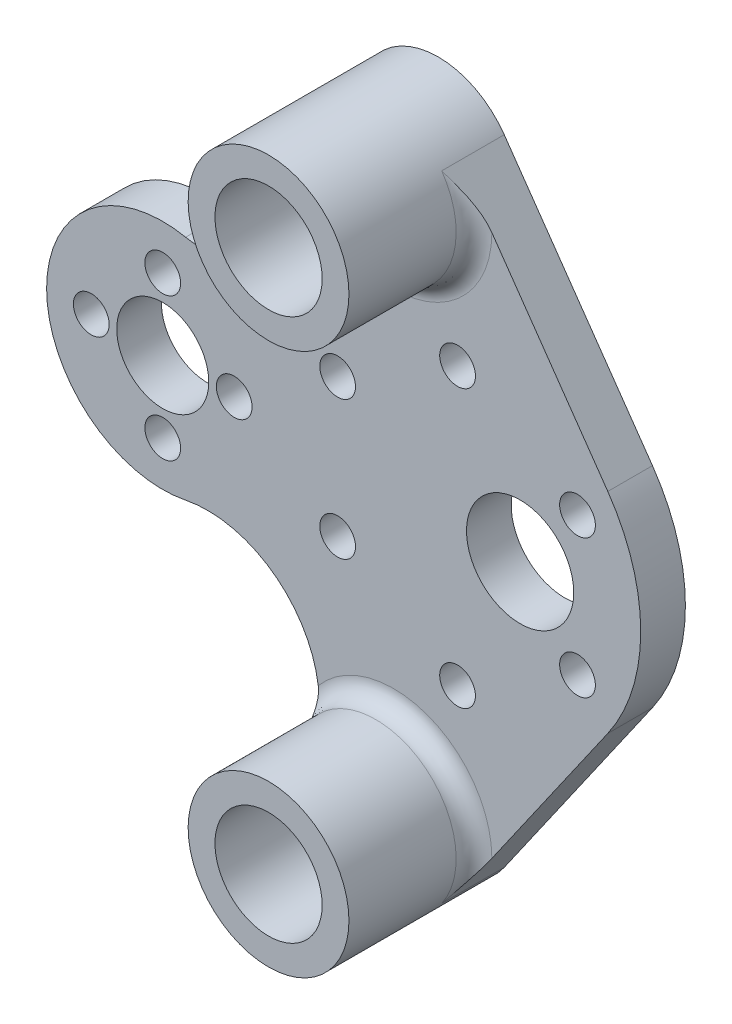
ISO-10303-21;
HEADER;
FILE_DESCRIPTION(('STEP AP214'),'2;1');
FILE_NAME('part.step','',(''),(''),'','','');
FILE_SCHEMA(('AUTOMOTIVE_DESIGN { 1 0 10303 214 1 1 1 1 }'));
ENDSEC;
DATA;
#1=APPLICATION_CONTEXT('core data for automotive mechanical design processes');
#2=APPLICATION_PROTOCOL_DEFINITION('international standard','automotive_design',2000,#1);
#3=PRODUCT_CONTEXT('',#1,'mechanical');
#4=PRODUCT('Part','Part','',(#3));
#5=PRODUCT_RELATED_PRODUCT_CATEGORY('part','',(#4));
#6=PRODUCT_DEFINITION_FORMATION('','',#4);
#7=PRODUCT_DEFINITION_CONTEXT('part definition',#1,'design');
#8=PRODUCT_DEFINITION('design','',#6,#7);
#9=PRODUCT_DEFINITION_SHAPE('','',#8);
#10=(LENGTH_UNIT() NAMED_UNIT(*) SI_UNIT(.MILLI.,.METRE.));
#11=(NAMED_UNIT(*) PLANE_ANGLE_UNIT() SI_UNIT($,.RADIAN.));
#12=(NAMED_UNIT(*) SI_UNIT($,.STERADIAN.) SOLID_ANGLE_UNIT());
#13=UNCERTAINTY_MEASURE_WITH_UNIT(LENGTH_MEASURE(1.E-05),#10,'distance_accuracy_value','');
#14=(GEOMETRIC_REPRESENTATION_CONTEXT(3) GLOBAL_UNCERTAINTY_ASSIGNED_CONTEXT((#13)) GLOBAL_UNIT_ASSIGNED_CONTEXT((#10,
#11,#12)) REPRESENTATION_CONTEXT('',''));
#15=CARTESIAN_POINT('',(0.,0.,0.));
#16=DIRECTION('',(0.,0.,1.));
#17=DIRECTION('',(1.,0.,0.));
#18=AXIS2_PLACEMENT_3D('',#15,#16,#17);
#19=CARTESIAN_POINT('',(-34.9787159958028,25.000734128205,5.));
#20=DIRECTION('',(0.,0.,-1.));
#21=DIRECTION('',(-1.,0.,0.));
#22=AXIS2_PLACEMENT_3D('',#19,#20,#21);
#23=CYLINDRICAL_SURFACE('',#22,12.5);
#24=CARTESIAN_POINT('',(-34.9787159958028,25.000734128205,0.));
#25=DIRECTION('',(0.,0.,1.));
#26=DIRECTION('',(1.,0.,0.));
#27=AXIS2_PLACEMENT_3D('',#24,#25,#26);
#28=CIRCLE('',#27,12.5);
#29=CARTESIAN_POINT('',(-37.4401297233505,12.7454723006535,0.));
#30=VERTEX_POINT('',#29);
#31=CARTESIAN_POINT('',(-22.8734809798206,28.1173485104857,0.));
#32=VERTEX_POINT('',#31);
#33=EDGE_CURVE('E132',#30,#32,#28,.T.);
#34=ORIENTED_EDGE('',*,*,#33,.F.);
#35=DIRECTION('',(0.,0.,-1.));
#36=VECTOR('',#35,1.);
#37=CARTESIAN_POINT('',(-37.4401297233505,12.7454723006535,5.));
#38=LINE('',#37,#36);
#39=CARTESIAN_POINT('',(-37.4401297233505,12.7454723006535,5.));
#40=VERTEX_POINT('',#39);
#41=EDGE_CURVE('E126',#40,#30,#38,.T.);
#42=ORIENTED_EDGE('',*,*,#41,.F.);
#43=CARTESIAN_POINT('',(-34.9787159958028,25.000734128205,5.));
#44=DIRECTION('',(0.,0.,1.));
#45=DIRECTION('',(1.,0.,0.));
#46=AXIS2_PLACEMENT_3D('',#43,#44,#45);
#47=CIRCLE('',#46,12.5);
#48=CARTESIAN_POINT('',(-22.5945455110129,23.3029940410132,5.));
#49=VERTEX_POINT('',#48);
#50=EDGE_CURVE('E130',#40,#49,#47,.T.);
#51=ORIENTED_EDGE('',*,*,#50,.T.);
#52=CARTESIAN_POINT('',(-22.5945455110129,23.3029940410132,5.));
#53=CARTESIAN_POINT('',(-22.5784386509426,23.4203873491574,5.00002194984655));
#54=CARTESIAN_POINT('',(-22.5640454098851,23.5378776584073,5.00576122954195));
#55=CARTESIAN_POINT('',(-22.5386946692942,23.7720686453386,5.02720305167435));
#56=CARTESIAN_POINT('',(-22.5277295054616,23.8887705054181,5.04288312772296));
#57=CARTESIAN_POINT('',(-22.5092806636017,24.1195652206952,5.08251290412739));
#58=CARTESIAN_POINT('',(-22.5017573983285,24.2336726111073,5.10636275248234));
#59=CARTESIAN_POINT('',(-22.4898841596137,24.4603905722542,5.16118223006757));
#60=CARTESIAN_POINT('',(-22.4855364212632,24.5730000340461,5.19215685393875));
#61=CARTESIAN_POINT('',(-22.4776205870708,24.8860256295329,5.28739886174794));
#62=CARTESIAN_POINT('',(-22.47747085748,25.0844724260291,5.35845119894978));
#63=CARTESIAN_POINT('',(-22.4861968563972,25.4753391982504,5.5150180032576));
#64=CARTESIAN_POINT('',(-22.4950786517616,25.6677550331645,5.60054215950437));
#65=CARTESIAN_POINT('',(-22.5212121377226,26.0482035544097,5.78268239757344));
#66=CARTESIAN_POINT('',(-22.5385194306428,26.2361983012766,5.87936886296627));
#67=CARTESIAN_POINT('',(-22.5809658989403,26.6071717159508,6.08011346235826));
#68=CARTESIAN_POINT('',(-22.6061026926867,26.7901518907344,6.18416934725042));
#69=CARTESIAN_POINT('',(-22.6658031537744,27.1641570378331,6.40412549696805));
#70=CARTESIAN_POINT('',(-22.7008835848277,27.354905018663,6.52035290831706));
#71=CARTESIAN_POINT('',(-22.7793742854088,27.7326174268201,6.7551836635535));
#72=CARTESIAN_POINT('',(-22.8227668453753,27.9195889802816,6.87378148440071));
#73=CARTESIAN_POINT('',(-22.8714375341858,28.1094034504309,6.99492817466204));
#74=CARTESIAN_POINT('',(-22.8724582831702,28.1133762361005,6.997464090689));
#75=CARTESIAN_POINT('',(-22.8734809798206,28.1173485104857,7.));
#76=B_SPLINE_CURVE_WITH_KNOTS('',3,(#52,#53,#54,#55,#56,#57,#58,#59,#60,#61,#62,#63,#64,#65,#66,
#67,#68,#69,#70,#71,#72,#73,#74,#75),.UNSPECIFIED.,.F.,.F.,(4,2,2,2,2,2,2,2,2,2,2,4),(0.,
0.355133282033193,0.709466803420707,1.05961561549306,1.4100106425511,2.04126925347174,
2.67295218774211,3.30886148192544,3.9445775294873,4.62267721642209,5.2993479190519,
5.31381520498501),.UNSPECIFIED.);
#77=CARTESIAN_POINT('',(-22.8734809798206,28.1173485104857,7.));
#78=VERTEX_POINT('',#77);
#79=EDGE_CURVE('E283',#49,#78,#76,.T.);
#80=ORIENTED_EDGE('',*,*,#79,.T.);
#81=DIRECTION('',(0.,0.,-1.));
#82=VECTOR('',#81,1.);
#83=CARTESIAN_POINT('',(-22.8734809798206,28.1173485104857,5.));
#84=LINE('',#83,#82);
#85=EDGE_CURVE('E206',#78,#32,#84,.T.);
#86=ORIENTED_EDGE('',*,*,#85,.T.);
#87=EDGE_LOOP('',(#34,#42,#51,#80,#86));
#88=FACE_BOUND('',#87,.T.);
#89=ADVANCED_FACE('F43',(#88),#23,.F.);
#90=CARTESIAN_POINT('',(-40.,0.,5.));
#91=DIRECTION('',(0.,0.,-1.));
#92=DIRECTION('',(-1.,0.,0.));
#93=AXIS2_PLACEMENT_3D('',#90,#91,#92);
#94=CYLINDRICAL_SURFACE('',#93,13.);
#95=CARTESIAN_POINT('',(-40.,0.,0.));
#96=DIRECTION('',(0.,0.,1.));
#97=DIRECTION('',(1.,0.,0.));
#98=AXIS2_PLACEMENT_3D('',#95,#96,#97);
#99=CIRCLE('',#98,13.);
#100=CARTESIAN_POINT('',(-37.4401297233505,-12.7454723006535,0.));
#101=VERTEX_POINT('',#100);
#102=EDGE_CURVE('E208',#30,#101,#99,.T.);
#103=ORIENTED_EDGE('',*,*,#102,.T.);
#104=DIRECTION('',(0.,0.,-1.));
#105=VECTOR('',#104,1.);
#106=CARTESIAN_POINT('',(-37.4401297233505,-12.7454723006535,5.));
#107=LINE('',#106,#105);
#108=CARTESIAN_POINT('',(-37.4401297233505,-12.7454723006535,5.));
#109=VERTEX_POINT('',#108);
#110=EDGE_CURVE('E137',#109,#101,#107,.T.);
#111=ORIENTED_EDGE('',*,*,#110,.F.);
#112=CARTESIAN_POINT('',(-40.,0.,5.));
#113=DIRECTION('',(0.,0.,1.));
#114=DIRECTION('',(1.,0.,0.));
#115=AXIS2_PLACEMENT_3D('',#112,#113,#114);
#116=CIRCLE('',#115,13.);
#117=EDGE_CURVE('E141',#40,#109,#116,.T.);
#118=ORIENTED_EDGE('',*,*,#117,.F.);
#119=ORIENTED_EDGE('',*,*,#41,.T.);
#120=EDGE_LOOP('',(#103,#111,#118,#119));
#121=FACE_BOUND('',#120,.T.);
#122=ADVANCED_FACE('F142',(#121),#94,.T.);
#123=CARTESIAN_POINT('',(-34.9787159958028,-25.000734128205,5.));
#124=DIRECTION('',(0.,0.,-1.));
#125=DIRECTION('',(-1.,0.,0.));
#126=AXIS2_PLACEMENT_3D('',#123,#124,#125);
#127=CYLINDRICAL_SURFACE('',#126,12.5);
#128=CARTESIAN_POINT('',(-34.9787159958028,-25.000734128205,0.));
#129=DIRECTION('',(0.,0.,1.));
#130=DIRECTION('',(1.,0.,0.));
#131=AXIS2_PLACEMENT_3D('',#128,#129,#130);
#132=CIRCLE('',#131,12.5);
#133=CARTESIAN_POINT('',(-22.8734809798206,-28.1173485104857,0.));
#134=VERTEX_POINT('',#133);
#135=EDGE_CURVE('E210',#134,#101,#132,.T.);
#136=ORIENTED_EDGE('',*,*,#135,.F.);
#137=DIRECTION('',(0.,0.,-1.));
#138=VECTOR('',#137,1.);
#139=CARTESIAN_POINT('',(-22.8734809798206,-28.1173485104857,5.));
#140=LINE('',#139,#138);
#141=CARTESIAN_POINT('',(-22.8734809798206,-28.1173485104857,7.));
#142=VERTEX_POINT('',#141);
#143=EDGE_CURVE('E64',#142,#134,#140,.T.);
#144=ORIENTED_EDGE('',*,*,#143,.F.);
#145=CARTESIAN_POINT('',(-22.5945455110129,-23.3029940410132,5.));
#146=CARTESIAN_POINT('',(-22.5784386509426,-23.4203873491574,5.00002194984655));
#147=CARTESIAN_POINT('',(-22.5640454098851,-23.5378776584073,5.00576122954195));
#148=CARTESIAN_POINT('',(-22.5386946692942,-23.7720686453386,5.02720305167435));
#149=CARTESIAN_POINT('',(-22.5277295054616,-23.8887705054181,5.04288312772296));
#150=CARTESIAN_POINT('',(-22.5092806636017,-24.1195652206952,5.08251290412739));
#151=CARTESIAN_POINT('',(-22.5017573983285,-24.2336726111073,5.10636275248234));
#152=CARTESIAN_POINT('',(-22.4898841596137,-24.4603905722542,5.16118223006757));
#153=CARTESIAN_POINT('',(-22.4855364212632,-24.5730000340461,5.19215685393875));
#154=CARTESIAN_POINT('',(-22.4776205870708,-24.8860256295329,5.28739886174794));
#155=CARTESIAN_POINT('',(-22.47747085748,-25.0844724260291,5.35845119894978));
#156=CARTESIAN_POINT('',(-22.4861968563972,-25.4753391982504,5.5150180032576));
#157=CARTESIAN_POINT('',(-22.4950786517616,-25.6677550331645,5.60054215950437));
#158=CARTESIAN_POINT('',(-22.5212121377226,-26.0482035544097,5.78268239757344));
#159=CARTESIAN_POINT('',(-22.5385194306428,-26.2361983012766,5.87936886296627));
#160=CARTESIAN_POINT('',(-22.5809658989403,-26.6071717159508,6.08011346235826));
#161=CARTESIAN_POINT('',(-22.6061026926867,-26.7901518907344,6.18416934725042));
#162=CARTESIAN_POINT('',(-22.6658031537744,-27.1641570378331,6.40412549696805));
#163=CARTESIAN_POINT('',(-22.7008835848277,-27.354905018663,6.52035290831706));
#164=CARTESIAN_POINT('',(-22.7793742854088,-27.7326174268201,6.7551836635535));
#165=CARTESIAN_POINT('',(-22.8227668453753,-27.9195889802816,6.87378148440071));
#166=CARTESIAN_POINT('',(-22.8714375341858,-28.1094034504309,6.99492817466204));
#167=CARTESIAN_POINT('',(-22.8724582831702,-28.1133762361005,6.997464090689));
#168=CARTESIAN_POINT('',(-22.8734809798206,-28.1173485104857,7.));
#169=B_SPLINE_CURVE_WITH_KNOTS('',3,(#145,#146,#147,#148,#149,#150,#151,#152,#153,#154,#155,
#156,#157,#158,#159,#160,#161,#162,#163,#164,#165,#166,#167,#168),.UNSPECIFIED.,.F.,.F.,(4,2,2,
2,2,2,2,2,2,2,2,4),(0.,0.355133282033193,0.709466803420707,1.05961561549306,1.4100106425511,
2.04126925347174,2.67295218774211,3.30886148192544,3.9445775294873,4.62267721642209,
5.2993479190519,5.31381520498501),.UNSPECIFIED.);
#170=CARTESIAN_POINT('',(-22.5945455110129,-23.3029940410132,5.));
#171=VERTEX_POINT('',#170);
#172=EDGE_CURVE('E57',#142,#171,#169,.F.);
#173=ORIENTED_EDGE('',*,*,#172,.T.);
#174=CARTESIAN_POINT('',(-34.9787159958028,-25.000734128205,5.));
#175=DIRECTION('',(0.,0.,1.));
#176=DIRECTION('',(1.,0.,0.));
#177=AXIS2_PLACEMENT_3D('',#174,#175,#176);
#178=CIRCLE('',#177,12.5);
#179=EDGE_CURVE('E145',#171,#109,#178,.T.);
#180=ORIENTED_EDGE('',*,*,#179,.T.);
#181=ORIENTED_EDGE('',*,*,#110,.T.);
#182=EDGE_LOOP('',(#136,#144,#173,#180,#181));
#183=FACE_BOUND('',#182,.T.);
#184=ADVANCED_FACE('F303',(#183),#127,.F.);
#185=CARTESIAN_POINT('',(-14.1577117683135,-30.3613108657278,5.));
#186=DIRECTION('',(0.,0.,-1.));
#187=DIRECTION('',(-1.,0.,0.));
#188=AXIS2_PLACEMENT_3D('',#185,#186,#187);
#189=CYLINDRICAL_SURFACE('',#188,9.);
#190=CARTESIAN_POINT('',(-14.1577117683135,-30.3613108657278,7.));
#191=DIRECTION('',(0.,0.,1.));
#192=DIRECTION('',(1.,0.,0.));
#193=AXIS2_PLACEMENT_3D('',#190,#191,#192);
#194=CIRCLE('',#193,9.);
#195=CARTESIAN_POINT('',(-6.77622271052783,-35.5104485886665,7.));
#196=VERTEX_POINT('',#195);
#197=EDGE_CURVE('E281',#196,#142,#194,.T.);
#198=ORIENTED_EDGE('',*,*,#197,.T.);
#199=ORIENTED_EDGE('',*,*,#143,.T.);
#200=CARTESIAN_POINT('',(-14.1577117683135,-30.3613108657278,0.));
#201=DIRECTION('',(0.,0.,1.));
#202=DIRECTION('',(1.,0.,0.));
#203=AXIS2_PLACEMENT_3D('',#200,#201,#202);
#204=CIRCLE('',#203,9.);
#205=CARTESIAN_POINT('',(-6.77622271052783,-35.5104485886665,0.));
#206=VERTEX_POINT('',#205);
#207=EDGE_CURVE('E213',#206,#134,#204,.F.);
#208=ORIENTED_EDGE('',*,*,#207,.F.);
#209=DIRECTION('',(0.,0.,-1.));
#210=VECTOR('',#209,1.);
#211=CARTESIAN_POINT('',(-6.77622271052783,-35.5104485886665,5.));
#212=LINE('',#211,#210);
#213=EDGE_CURVE('E72',#196,#206,#212,.T.);
#214=ORIENTED_EDGE('',*,*,#213,.F.);
#215=EDGE_LOOP('',(#198,#199,#208,#214));
#216=FACE_BOUND('',#215,.T.);
#217=CARTESIAN_POINT('',(-14.1577117683135,-30.3613108657278,19.));
#218=DIRECTION('',(0.,0.,1.));
#219=DIRECTION('',(1.,0.,0.));
#220=AXIS2_PLACEMENT_3D('',#217,#218,#219);
#221=CIRCLE('',#220,9.);
#222=CARTESIAN_POINT('',(-5.15771176831346,-30.3613108657278,19.));
#223=VERTEX_POINT('',#222);
#224=EDGE_CURVE('E343',#223,#223,#221,.F.);
#225=ORIENTED_EDGE('',*,*,#224,.T.);
#226=EDGE_LOOP('',(#225));
#227=FACE_BOUND('',#226,.T.);
#228=ADVANCED_FACE('F307',(#216,#227),#189,.T.);
#229=CARTESIAN_POINT('',(12.104692175185,-8.44392325394907,5.));
#230=DIRECTION('',(-0.82016545086507,0.572126413659862,0.));
#231=DIRECTION('',(-0.572126413659862,-0.82016545086507,0.));
#232=AXIS2_PLACEMENT_3D('',#229,#230,#231);
#233=PLANE('',#232);
#234=DIRECTION('',(0.572126413659862,0.82016545086507,0.));
#235=VECTOR('',#234,1.);
#236=CARTESIAN_POINT('',(12.104692175185,-8.44392325394907,0.));
#237=LINE('',#236,#235);
#238=CARTESIAN_POINT('',(9.81339174273394,-11.7285914800272,0.));
#239=VERTEX_POINT('',#238);
#240=EDGE_CURVE('E216',#206,#239,#237,.T.);
#241=ORIENTED_EDGE('',*,*,#240,.T.);
#242=DIRECTION('',(0.,0.,-1.));
#243=VECTOR('',#242,1.);
#244=CARTESIAN_POINT('',(9.81339174273394,-11.7285914800272,5.));
#245=LINE('',#244,#243);
#246=CARTESIAN_POINT('',(9.81339174273394,-11.7285914800272,5.));
#247=VERTEX_POINT('',#246);
#248=EDGE_CURVE('E270',#247,#239,#245,.T.);
#249=ORIENTED_EDGE('',*,*,#248,.F.);
#250=DIRECTION('',(0.572126413659862,0.82016545086507,0.));
#251=VECTOR('',#250,1.);
#252=CARTESIAN_POINT('',(12.104692175185,-8.44392325394907,5.));
#253=LINE('',#252,#251);
#254=CARTESIAN_POINT('',(-3.15777755711015,-30.3232668228414,5.));
#255=VERTEX_POINT('',#254);
#256=EDGE_CURVE('E163',#255,#247,#253,.T.);
#257=ORIENTED_EDGE('',*,*,#256,.F.);
#258=CARTESIAN_POINT('',(-3.15777755711016,-30.3232668228414,5.));
#259=CARTESIAN_POINT('',(-3.22342689337555,-30.4173776979759,5.00001296267413));
#260=CARTESIAN_POINT('',(-3.28905588159602,-30.5114594033972,5.00326363988943));
#261=CARTESIAN_POINT('',(-3.42009806793353,-30.6993134707393,5.01561996221683));
#262=CARTESIAN_POINT('',(-3.48551136890532,-30.7930859801064,5.02472221982434));
#263=CARTESIAN_POINT('',(-3.61583447462857,-30.9799092174394,5.04812876342714));
#264=CARTESIAN_POINT('',(-3.68074518868349,-31.0729612489271,5.06241791695203));
#265=CARTESIAN_POINT('',(-3.81017831165033,-31.2585086613877,5.09567617548327));
#266=CARTESIAN_POINT('',(-3.8747006569723,-31.351003951202,5.11464602662329));
#267=CARTESIAN_POINT('',(-4.0660363061941,-31.6252910410196,5.17733531907624));
#268=CARTESIAN_POINT('',(-4.19220308374418,-31.806156020372,5.22714398049324));
#269=CARTESIAN_POINT('',(-4.44265218507195,-32.1651845413509,5.33995740201373));
#270=CARTESIAN_POINT('',(-4.56693281465061,-32.3433456542772,5.4029733506712));
#271=CARTESIAN_POINT('',(-4.86893038531955,-32.7762709095951,5.5701415979798));
#272=CARTESIAN_POINT('',(-5.0455953518125,-33.0295270055143,5.68006275367627));
#273=CARTESIAN_POINT('',(-5.39549003815001,-33.5311146377643,5.91517768006302));
#274=CARTESIAN_POINT('',(-5.56871966953221,-33.7794460472808,6.04037184345209));
#275=CARTESIAN_POINT('',(-6.08592721792256,-34.520883170246,6.43129681383576));
#276=CARTESIAN_POINT('',(-6.42622718692445,-35.0087164022764,6.71162123138849));
#277=CARTESIAN_POINT('',(-6.76967670398516,-35.5010646338634,6.99460642124432));
#278=CARTESIAN_POINT('',(-6.77294971084746,-35.5057566164128,6.99730322095226));
#279=CARTESIAN_POINT('',(-6.77622271052783,-35.5104485886665,7.));
#280=B_SPLINE_CURVE_WITH_KNOTS('',3,(#258,#259,#260,#261,#262,#263,#264,#265,#266,#267,#268,
#269,#270,#271,#272,#273,#274,#275,#276,#277,#278,#279),.UNSPECIFIED.,.F.,.F.,(4,2,2,2,2,2,2,2,
2,2,4),(0.,0.344141629174061,0.688084212489455,1.03103132342274,1.37403313771681,
2.0516972689332,2.72993782074366,3.71258916082022,4.69526577210549,6.66726674453529,
6.68624041049632),.UNSPECIFIED.);
#281=EDGE_CURVE('E11',#255,#196,#280,.T.);
#282=ORIENTED_EDGE('',*,*,#281,.T.);
#283=ORIENTED_EDGE('',*,*,#213,.T.);
#284=EDGE_LOOP('',(#241,#249,#257,#282,#283));
#285=FACE_BOUND('',#284,.T.);
#286=ADVANCED_FACE('F334',(#285),#233,.F.);
#287=CARTESIAN_POINT('',(-7.,0.,5.));
#288=DIRECTION('',(0.,0.,-1.));
#289=DIRECTION('',(-1.,0.,0.));
#290=AXIS2_PLACEMENT_3D('',#287,#288,#289);
#291=CYLINDRICAL_SURFACE('',#290,20.5);
#292=CARTESIAN_POINT('',(-7.,0.,0.));
#293=DIRECTION('',(0.,0.,1.));
#294=DIRECTION('',(1.,0.,0.));
#295=AXIS2_PLACEMENT_3D('',#292,#293,#294);
#296=CIRCLE('',#295,20.5);
#297=CARTESIAN_POINT('',(9.81339174273394,11.7285914800272,0.));
#298=VERTEX_POINT('',#297);
#299=EDGE_CURVE('E218',#239,#298,#296,.T.);
#300=ORIENTED_EDGE('',*,*,#299,.T.);
#301=DIRECTION('',(0.,0.,-1.));
#302=VECTOR('',#301,1.);
#303=CARTESIAN_POINT('',(9.81339174273394,11.7285914800272,5.));
#304=LINE('',#303,#302);
#305=CARTESIAN_POINT('',(9.81339174273394,11.7285914800272,5.));
#306=VERTEX_POINT('',#305);
#307=EDGE_CURVE('E268',#306,#298,#304,.T.);
#308=ORIENTED_EDGE('',*,*,#307,.F.);
#309=CARTESIAN_POINT('',(-7.,0.,5.));
#310=DIRECTION('',(0.,0.,1.));
#311=DIRECTION('',(1.,0.,0.));
#312=AXIS2_PLACEMENT_3D('',#309,#310,#311);
#313=CIRCLE('',#312,20.5);
#314=EDGE_CURVE('E165',#247,#306,#313,.T.);
#315=ORIENTED_EDGE('',*,*,#314,.F.);
#316=ORIENTED_EDGE('',*,*,#248,.T.);
#317=EDGE_LOOP('',(#300,#308,#315,#316));
#318=FACE_BOUND('',#317,.T.);
#319=ADVANCED_FACE('F338',(#318),#291,.T.);
#320=CARTESIAN_POINT('',(12.104692175185,8.44392325394907,5.));
#321=DIRECTION('',(0.82016545086507,0.572126413659862,0.));
#322=DIRECTION('',(-0.572126413659862,0.82016545086507,0.));
#323=AXIS2_PLACEMENT_3D('',#320,#321,#322);
#324=PLANE('',#323);
#325=DIRECTION('',(0.572126413659862,-0.82016545086507,0.));
#326=VECTOR('',#325,1.);
#327=CARTESIAN_POINT('',(12.104692175185,8.44392325394907,0.));
#328=LINE('',#327,#326);
#329=CARTESIAN_POINT('',(-6.77622271052783,35.5104485886665,0.));
#330=VERTEX_POINT('',#329);
#331=EDGE_CURVE('E221',#330,#298,#328,.T.);
#332=ORIENTED_EDGE('',*,*,#331,.F.);
#333=DIRECTION('',(0.,0.,-1.));
#334=VECTOR('',#333,1.);
#335=CARTESIAN_POINT('',(-6.77622271052783,35.5104485886665,5.));
#336=LINE('',#335,#334);
#337=CARTESIAN_POINT('',(-6.77622271052783,35.5104485886665,7.));
#338=VERTEX_POINT('',#337);
#339=EDGE_CURVE('E266',#338,#330,#336,.T.);
#340=ORIENTED_EDGE('',*,*,#339,.F.);
#341=CARTESIAN_POINT('',(-3.15777755711016,30.3232668228414,5.));
#342=CARTESIAN_POINT('',(-3.22342689337555,30.4173776979759,5.00001296267413));
#343=CARTESIAN_POINT('',(-3.28905588159602,30.5114594033972,5.00326363988943));
#344=CARTESIAN_POINT('',(-3.42009806793353,30.6993134707393,5.01561996221683));
#345=CARTESIAN_POINT('',(-3.48551136890532,30.7930859801064,5.02472221982434));
#346=CARTESIAN_POINT('',(-3.61583447462857,30.9799092174394,5.04812876342714));
#347=CARTESIAN_POINT('',(-3.68074518868349,31.0729612489271,5.06241791695203));
#348=CARTESIAN_POINT('',(-3.81017831165033,31.2585086613877,5.09567617548327));
#349=CARTESIAN_POINT('',(-3.8747006569723,31.351003951202,5.11464602662329));
#350=CARTESIAN_POINT('',(-4.0660363061941,31.6252910410196,5.17733531907624));
#351=CARTESIAN_POINT('',(-4.19220308374418,31.806156020372,5.22714398049324));
#352=CARTESIAN_POINT('',(-4.44265218507195,32.1651845413509,5.33995740201373));
#353=CARTESIAN_POINT('',(-4.56693281465061,32.3433456542772,5.4029733506712));
#354=CARTESIAN_POINT('',(-4.86893038531955,32.7762709095951,5.5701415979798));
#355=CARTESIAN_POINT('',(-5.0455953518125,33.0295270055143,5.68006275367627));
#356=CARTESIAN_POINT('',(-5.39549003815001,33.5311146377643,5.91517768006302));
#357=CARTESIAN_POINT('',(-5.56871966953221,33.7794460472808,6.04037184345209));
#358=CARTESIAN_POINT('',(-6.08592721792256,34.520883170246,6.43129681383576));
#359=CARTESIAN_POINT('',(-6.42622718692445,35.0087164022764,6.71162123138849));
#360=CARTESIAN_POINT('',(-6.76967670398516,35.5010646338634,6.99460642124432));
#361=CARTESIAN_POINT('',(-6.77294971084746,35.5057566164128,6.99730322095226));
#362=CARTESIAN_POINT('',(-6.77622271052783,35.5104485886665,7.));
#363=B_SPLINE_CURVE_WITH_KNOTS('',3,(#341,#342,#343,#344,#345,#346,#347,#348,#349,#350,#351,
#352,#353,#354,#355,#356,#357,#358,#359,#360,#361,#362),.UNSPECIFIED.,.F.,.F.,(4,2,2,2,2,2,2,2,
2,2,4),(0.,0.344141629174061,0.688084212489455,1.03103132342274,1.37403313771681,
2.0516972689332,2.72993782074366,3.71258916082022,4.69526577210549,6.66726674453529,
6.68624041049632),.UNSPECIFIED.);
#364=CARTESIAN_POINT('',(-3.15777755711015,30.3232668228414,5.));
#365=VERTEX_POINT('',#364);
#366=EDGE_CURVE('E290',#338,#365,#363,.F.);
#367=ORIENTED_EDGE('',*,*,#366,.T.);
#368=DIRECTION('',(0.572126413659862,-0.82016545086507,0.));
#369=VECTOR('',#368,1.);
#370=CARTESIAN_POINT('',(12.104692175185,8.44392325394907,5.));
#371=LINE('',#370,#369);
#372=EDGE_CURVE('E168',#365,#306,#371,.T.);
#373=ORIENTED_EDGE('',*,*,#372,.T.);
#374=ORIENTED_EDGE('',*,*,#307,.T.);
#375=EDGE_LOOP('',(#332,#340,#367,#373,#374));
#376=FACE_BOUND('',#375,.T.);
#377=ADVANCED_FACE('F315',(#376),#324,.T.);
#378=CARTESIAN_POINT('',(-20.4233937586588,7.75,5.));
#379=DIRECTION('',(0.,0.,-1.));
#380=DIRECTION('',(-1.,0.,0.));
#381=AXIS2_PLACEMENT_3D('',#378,#379,#380);
#382=CYLINDRICAL_SURFACE('',#381,2.);
#383=CARTESIAN_POINT('',(-20.4233937586588,7.75,5.));
#384=DIRECTION('',(0.,0.,1.));
#385=DIRECTION('',(1.,0.,0.));
#386=AXIS2_PLACEMENT_3D('',#383,#384,#385);
#387=CIRCLE('',#386,2.);
#388=CARTESIAN_POINT('',(-18.4233937586588,7.75,5.));
#389=VERTEX_POINT('',#388);
#390=EDGE_CURVE('E203',#389,#389,#387,.T.);
#391=ORIENTED_EDGE('',*,*,#390,.T.);
#392=EDGE_LOOP('',(#391));
#393=FACE_BOUND('',#392,.T.);
#394=CARTESIAN_POINT('',(-20.4233937586588,7.75,0.));
#395=DIRECTION('',(0.,0.,1.));
#396=DIRECTION('',(1.,0.,0.));
#397=AXIS2_PLACEMENT_3D('',#394,#395,#396);
#398=CIRCLE('',#397,2.);
#399=CARTESIAN_POINT('',(-18.4233937586588,7.75,0.));
#400=VERTEX_POINT('',#399);
#401=EDGE_CURVE('E156',#400,#400,#398,.T.);
#402=ORIENTED_EDGE('',*,*,#401,.F.);
#403=EDGE_LOOP('',(#402));
#404=FACE_BOUND('',#403,.T.);
#405=ADVANCED_FACE('F375',(#393,#404),#382,.F.);
#406=CARTESIAN_POINT('',(0.,0.,5.));
#407=DIRECTION('',(0.,0.,-1.));
#408=DIRECTION('',(-1.,0.,0.));
#409=AXIS2_PLACEMENT_3D('',#406,#407,#408);
#410=CYLINDRICAL_SURFACE('',#409,6.);
#411=CARTESIAN_POINT('',(0.,0.,5.));
#412=DIRECTION('',(0.,0.,1.));
#413=DIRECTION('',(1.,0.,0.));
#414=AXIS2_PLACEMENT_3D('',#411,#412,#413);
#415=CIRCLE('',#414,6.);
#416=CARTESIAN_POINT('',(6.,0.,5.));
#417=VERTEX_POINT('',#416);
#418=EDGE_CURVE('E200',#417,#417,#415,.T.);
#419=ORIENTED_EDGE('',*,*,#418,.T.);
#420=EDGE_LOOP('',(#419));
#421=FACE_BOUND('',#420,.T.);
#422=CARTESIAN_POINT('',(0.,0.,0.));
#423=DIRECTION('',(0.,0.,1.));
#424=DIRECTION('',(1.,0.,0.));
#425=AXIS2_PLACEMENT_3D('',#422,#423,#424);
#426=CIRCLE('',#425,6.);
#427=CARTESIAN_POINT('',(6.,0.,0.));
#428=VERTEX_POINT('',#427);
#429=EDGE_CURVE('E260',#428,#428,#426,.T.);
#430=ORIENTED_EDGE('',*,*,#429,.F.);
#431=EDGE_LOOP('',(#430));
#432=FACE_BOUND('',#431,.T.);
#433=ADVANCED_FACE('F403',(#421,#432),#410,.F.);
#434=CARTESIAN_POINT('',(-7.,15.5,5.));
#435=DIRECTION('',(0.,0.,-1.));
#436=DIRECTION('',(-1.,0.,0.));
#437=AXIS2_PLACEMENT_3D('',#434,#435,#436);
#438=CYLINDRICAL_SURFACE('',#437,2.);
#439=CARTESIAN_POINT('',(-7.,15.5,5.));
#440=DIRECTION('',(0.,0.,1.));
#441=DIRECTION('',(1.,0.,0.));
#442=AXIS2_PLACEMENT_3D('',#439,#440,#441);
#443=CIRCLE('',#442,2.);
#444=CARTESIAN_POINT('',(-5.,15.5,5.));
#445=VERTEX_POINT('',#444);
#446=EDGE_CURVE('E197',#445,#445,#443,.T.);
#447=ORIENTED_EDGE('',*,*,#446,.T.);
#448=EDGE_LOOP('',(#447));
#449=FACE_BOUND('',#448,.T.);
#450=CARTESIAN_POINT('',(-7.,15.5,0.));
#451=DIRECTION('',(0.,0.,1.));
#452=DIRECTION('',(1.,0.,0.));
#453=AXIS2_PLACEMENT_3D('',#450,#451,#452);
#454=CIRCLE('',#453,2.);
#455=CARTESIAN_POINT('',(-5.,15.5,0.));
#456=VERTEX_POINT('',#455);
#457=EDGE_CURVE('E257',#456,#456,#454,.T.);
#458=ORIENTED_EDGE('',*,*,#457,.F.);
#459=EDGE_LOOP('',(#458));
#460=FACE_BOUND('',#459,.T.);
#461=ADVANCED_FACE('F413',(#449,#460),#438,.F.);
#462=CARTESIAN_POINT('',(6.4233937586588,7.75,5.));
#463=DIRECTION('',(0.,0.,-1.));
#464=DIRECTION('',(-1.,0.,0.));
#465=AXIS2_PLACEMENT_3D('',#462,#463,#464);
#466=CYLINDRICAL_SURFACE('',#465,2.);
#467=CARTESIAN_POINT('',(6.4233937586588,7.75,5.));
#468=DIRECTION('',(0.,0.,1.));
#469=DIRECTION('',(1.,0.,0.));
#470=AXIS2_PLACEMENT_3D('',#467,#468,#469);
#471=CIRCLE('',#470,2.);
#472=CARTESIAN_POINT('',(8.4233937586588,7.75,5.));
#473=VERTEX_POINT('',#472);
#474=EDGE_CURVE('E194',#473,#473,#471,.T.);
#475=ORIENTED_EDGE('',*,*,#474,.T.);
#476=EDGE_LOOP('',(#475));
#477=FACE_BOUND('',#476,.T.);
#478=CARTESIAN_POINT('',(6.4233937586588,7.75,0.));
#479=DIRECTION('',(0.,0.,1.));
#480=DIRECTION('',(1.,0.,0.));
#481=AXIS2_PLACEMENT_3D('',#478,#479,#480);
#482=CIRCLE('',#481,2.);
#483=CARTESIAN_POINT('',(8.4233937586588,7.75,0.));
#484=VERTEX_POINT('',#483);
#485=EDGE_CURVE('E254',#484,#484,#482,.T.);
#486=ORIENTED_EDGE('',*,*,#485,.F.);
#487=EDGE_LOOP('',(#486));
#488=FACE_BOUND('',#487,.T.);
#489=ADVANCED_FACE('F423',(#477,#488),#466,.F.);
#490=CARTESIAN_POINT('',(6.4233937586588,-7.75,5.));
#491=DIRECTION('',(0.,0.,-1.));
#492=DIRECTION('',(-1.,0.,0.));
#493=AXIS2_PLACEMENT_3D('',#490,#491,#492);
#494=CYLINDRICAL_SURFACE('',#493,2.);
#495=CARTESIAN_POINT('',(6.4233937586588,-7.75,5.));
#496=DIRECTION('',(0.,0.,1.));
#497=DIRECTION('',(1.,0.,0.));
#498=AXIS2_PLACEMENT_3D('',#495,#496,#497);
#499=CIRCLE('',#498,2.);
#500=CARTESIAN_POINT('',(8.4233937586588,-7.75,5.));
#501=VERTEX_POINT('',#500);
#502=EDGE_CURVE('E191',#501,#501,#499,.T.);
#503=ORIENTED_EDGE('',*,*,#502,.T.);
#504=EDGE_LOOP('',(#503));
#505=FACE_BOUND('',#504,.T.);
#506=CARTESIAN_POINT('',(6.4233937586588,-7.75,0.));
#507=DIRECTION('',(0.,0.,1.));
#508=DIRECTION('',(1.,0.,0.));
#509=AXIS2_PLACEMENT_3D('',#506,#507,#508);
#510=CIRCLE('',#509,2.);
#511=CARTESIAN_POINT('',(8.4233937586588,-7.75,0.));
#512=VERTEX_POINT('',#511);
#513=EDGE_CURVE('E251',#512,#512,#510,.T.);
#514=ORIENTED_EDGE('',*,*,#513,.F.);
#515=EDGE_LOOP('',(#514));
#516=FACE_BOUND('',#515,.T.);
#517=ADVANCED_FACE('F433',(#505,#516),#494,.F.);
#518=CARTESIAN_POINT('',(-6.99999999999999,-15.5,5.));
#519=DIRECTION('',(0.,0.,-1.));
#520=DIRECTION('',(-1.,0.,0.));
#521=AXIS2_PLACEMENT_3D('',#518,#519,#520);
#522=CYLINDRICAL_SURFACE('',#521,2.);
#523=CARTESIAN_POINT('',(-6.99999999999999,-15.5,5.));
#524=DIRECTION('',(0.,0.,1.));
#525=DIRECTION('',(1.,0.,0.));
#526=AXIS2_PLACEMENT_3D('',#523,#524,#525);
#527=CIRCLE('',#526,2.);
#528=CARTESIAN_POINT('',(-4.99999999999999,-15.5,5.));
#529=VERTEX_POINT('',#528);
#530=EDGE_CURVE('E188',#529,#529,#527,.T.);
#531=ORIENTED_EDGE('',*,*,#530,.T.);
#532=EDGE_LOOP('',(#531));
#533=FACE_BOUND('',#532,.T.);
#534=CARTESIAN_POINT('',(-6.99999999999999,-15.5,0.));
#535=DIRECTION('',(0.,0.,1.));
#536=DIRECTION('',(1.,0.,0.));
#537=AXIS2_PLACEMENT_3D('',#534,#535,#536);
#538=CIRCLE('',#537,2.);
#539=CARTESIAN_POINT('',(-4.99999999999999,-15.5,0.));
#540=VERTEX_POINT('',#539);
#541=EDGE_CURVE('E248',#540,#540,#538,.T.);
#542=ORIENTED_EDGE('',*,*,#541,.F.);
#543=EDGE_LOOP('',(#542));
#544=FACE_BOUND('',#543,.T.);
#545=ADVANCED_FACE('F443',(#533,#544),#522,.F.);
#546=CARTESIAN_POINT('',(-20.4233937586588,-7.75,5.));
#547=DIRECTION('',(0.,0.,-1.));
#548=DIRECTION('',(-1.,0.,0.));
#549=AXIS2_PLACEMENT_3D('',#546,#547,#548);
#550=CYLINDRICAL_SURFACE('',#549,2.);
#551=CARTESIAN_POINT('',(-20.4233937586588,-7.75,5.));
#552=DIRECTION('',(0.,0.,1.));
#553=DIRECTION('',(1.,0.,0.));
#554=AXIS2_PLACEMENT_3D('',#551,#552,#553);
#555=CIRCLE('',#554,2.);
#556=CARTESIAN_POINT('',(-18.4233937586588,-7.75,5.));
#557=VERTEX_POINT('',#556);
#558=EDGE_CURVE('E185',#557,#557,#555,.T.);
#559=ORIENTED_EDGE('',*,*,#558,.T.);
#560=EDGE_LOOP('',(#559));
#561=FACE_BOUND('',#560,.T.);
#562=CARTESIAN_POINT('',(-20.4233937586588,-7.75,0.));
#563=DIRECTION('',(0.,0.,1.));
#564=DIRECTION('',(1.,0.,0.));
#565=AXIS2_PLACEMENT_3D('',#562,#563,#564);
#566=CIRCLE('',#565,2.);
#567=CARTESIAN_POINT('',(-18.4233937586588,-7.75,0.));
#568=VERTEX_POINT('',#567);
#569=EDGE_CURVE('E245',#568,#568,#566,.T.);
#570=ORIENTED_EDGE('',*,*,#569,.F.);
#571=EDGE_LOOP('',(#570));
#572=FACE_BOUND('',#571,.T.);
#573=ADVANCED_FACE('F453',(#561,#572),#550,.F.);
#574=CARTESIAN_POINT('',(-14.1577117683135,30.3613108657278,5.));
#575=DIRECTION('',(0.,0.,-1.));
#576=DIRECTION('',(-1.,0.,0.));
#577=AXIS2_PLACEMENT_3D('',#574,#575,#576);
#578=CYLINDRICAL_SURFACE('',#577,6.);
#579=CARTESIAN_POINT('',(-14.1577117683135,30.3613108657278,0.));
#580=DIRECTION('',(0.,0.,1.));
#581=DIRECTION('',(1.,0.,0.));
#582=AXIS2_PLACEMENT_3D('',#579,#580,#581);
#583=CIRCLE('',#582,6.);
#584=CARTESIAN_POINT('',(-8.15771176831346,30.3613108657278,0.));
#585=VERTEX_POINT('',#584);
#586=EDGE_CURVE('E242',#585,#585,#583,.T.);
#587=ORIENTED_EDGE('',*,*,#586,.F.);
#588=EDGE_LOOP('',(#587));
#589=FACE_BOUND('',#588,.T.);
#590=CARTESIAN_POINT('',(-14.1577117683135,30.3613108657278,19.));
#591=DIRECTION('',(0.,0.,1.));
#592=DIRECTION('',(1.,0.,0.));
#593=AXIS2_PLACEMENT_3D('',#590,#591,#592);
#594=CIRCLE('',#593,6.);
#595=CARTESIAN_POINT('',(-8.15771176831346,30.3613108657278,19.));
#596=VERTEX_POINT('',#595);
#597=EDGE_CURVE('E348',#596,#596,#594,.T.);
#598=ORIENTED_EDGE('',*,*,#597,.T.);
#599=EDGE_LOOP('',(#598));
#600=FACE_BOUND('',#599,.T.);
#601=ADVANCED_FACE('F463',(#589,#600),#578,.F.);
#602=CARTESIAN_POINT('',(-40.,-8.,5.));
#603=DIRECTION('',(0.,0.,-1.));
#604=DIRECTION('',(-1.,0.,0.));
#605=AXIS2_PLACEMENT_3D('',#602,#603,#604);
#606=CYLINDRICAL_SURFACE('',#605,2.);
#607=CARTESIAN_POINT('',(-40.,-8.,5.));
#608=DIRECTION('',(0.,0.,1.));
#609=DIRECTION('',(1.,0.,0.));
#610=AXIS2_PLACEMENT_3D('',#607,#608,#609);
#611=CIRCLE('',#610,2.);
#612=CARTESIAN_POINT('',(-38.,-8.,5.));
#613=VERTEX_POINT('',#612);
#614=EDGE_CURVE('E182',#613,#613,#611,.T.);
#615=ORIENTED_EDGE('',*,*,#614,.T.);
#616=EDGE_LOOP('',(#615));
#617=FACE_BOUND('',#616,.T.);
#618=CARTESIAN_POINT('',(-40.,-8.,0.));
#619=DIRECTION('',(0.,0.,1.));
#620=DIRECTION('',(1.,0.,0.));
#621=AXIS2_PLACEMENT_3D('',#618,#619,#620);
#622=CIRCLE('',#621,2.);
#623=CARTESIAN_POINT('',(-38.,-8.,0.));
#624=VERTEX_POINT('',#623);
#625=EDGE_CURVE('E239',#624,#624,#622,.T.);
#626=ORIENTED_EDGE('',*,*,#625,.F.);
#627=EDGE_LOOP('',(#626));
#628=FACE_BOUND('',#627,.T.);
#629=ADVANCED_FACE('F475',(#617,#628),#606,.F.);
#630=CARTESIAN_POINT('',(-40.,0.,5.));
#631=DIRECTION('',(0.,0.,-1.));
#632=DIRECTION('',(-1.,0.,0.));
#633=AXIS2_PLACEMENT_3D('',#630,#631,#632);
#634=CYLINDRICAL_SURFACE('',#633,5.15);
#635=CARTESIAN_POINT('',(-40.,0.,5.));
#636=DIRECTION('',(0.,0.,1.));
#637=DIRECTION('',(1.,0.,0.));
#638=AXIS2_PLACEMENT_3D('',#635,#636,#637);
#639=CIRCLE('',#638,5.15);
#640=CARTESIAN_POINT('',(-34.85,0.,5.));
#641=VERTEX_POINT('',#640);
#642=EDGE_CURVE('E179',#641,#641,#639,.T.);
#643=ORIENTED_EDGE('',*,*,#642,.T.);
#644=EDGE_LOOP('',(#643));
#645=FACE_BOUND('',#644,.T.);
#646=CARTESIAN_POINT('',(-40.,0.,0.));
#647=DIRECTION('',(0.,0.,1.));
#648=DIRECTION('',(1.,0.,0.));
#649=AXIS2_PLACEMENT_3D('',#646,#647,#648);
#650=CIRCLE('',#649,5.15);
#651=CARTESIAN_POINT('',(-34.85,0.,0.));
#652=VERTEX_POINT('',#651);
#653=EDGE_CURVE('E236',#652,#652,#650,.T.);
#654=ORIENTED_EDGE('',*,*,#653,.F.);
#655=EDGE_LOOP('',(#654));
#656=FACE_BOUND('',#655,.T.);
#657=ADVANCED_FACE('F485',(#645,#656),#634,.F.);
#658=CARTESIAN_POINT('',(-48.,0.,5.));
#659=DIRECTION('',(0.,0.,-1.));
#660=DIRECTION('',(-1.,0.,0.));
#661=AXIS2_PLACEMENT_3D('',#658,#659,#660);
#662=CYLINDRICAL_SURFACE('',#661,2.);
#663=CARTESIAN_POINT('',(-48.,0.,5.));
#664=DIRECTION('',(0.,0.,1.));
#665=DIRECTION('',(1.,0.,0.));
#666=AXIS2_PLACEMENT_3D('',#663,#664,#665);
#667=CIRCLE('',#666,2.);
#668=CARTESIAN_POINT('',(-46.,0.,5.));
#669=VERTEX_POINT('',#668);
#670=EDGE_CURVE('E176',#669,#669,#667,.T.);
#671=ORIENTED_EDGE('',*,*,#670,.T.);
#672=EDGE_LOOP('',(#671));
#673=FACE_BOUND('',#672,.T.);
#674=CARTESIAN_POINT('',(-48.,0.,0.));
#675=DIRECTION('',(0.,0.,1.));
#676=DIRECTION('',(1.,0.,0.));
#677=AXIS2_PLACEMENT_3D('',#674,#675,#676);
#678=CIRCLE('',#677,2.);
#679=CARTESIAN_POINT('',(-46.,0.,0.));
#680=VERTEX_POINT('',#679);
#681=EDGE_CURVE('E233',#680,#680,#678,.T.);
#682=ORIENTED_EDGE('',*,*,#681,.F.);
#683=EDGE_LOOP('',(#682));
#684=FACE_BOUND('',#683,.T.);
#685=ADVANCED_FACE('F495',(#673,#684),#662,.F.);
#686=CARTESIAN_POINT('',(-40.,8.,5.));
#687=DIRECTION('',(0.,0.,-1.));
#688=DIRECTION('',(-1.,0.,0.));
#689=AXIS2_PLACEMENT_3D('',#686,#687,#688);
#690=CYLINDRICAL_SURFACE('',#689,2.);
#691=CARTESIAN_POINT('',(-40.,8.,5.));
#692=DIRECTION('',(0.,0.,1.));
#693=DIRECTION('',(1.,0.,0.));
#694=AXIS2_PLACEMENT_3D('',#691,#692,#693);
#695=CIRCLE('',#694,2.);
#696=CARTESIAN_POINT('',(-38.,8.,5.));
#697=VERTEX_POINT('',#696);
#698=EDGE_CURVE('E173',#697,#697,#695,.T.);
#699=ORIENTED_EDGE('',*,*,#698,.T.);
#700=EDGE_LOOP('',(#699));
#701=FACE_BOUND('',#700,.T.);
#702=CARTESIAN_POINT('',(-40.,8.,0.));
#703=DIRECTION('',(0.,0.,1.));
#704=DIRECTION('',(1.,0.,0.));
#705=AXIS2_PLACEMENT_3D('',#702,#703,#704);
#706=CIRCLE('',#705,2.);
#707=CARTESIAN_POINT('',(-38.,8.,0.));
#708=VERTEX_POINT('',#707);
#709=EDGE_CURVE('E230',#708,#708,#706,.T.);
#710=ORIENTED_EDGE('',*,*,#709,.F.);
#711=EDGE_LOOP('',(#710));
#712=FACE_BOUND('',#711,.T.);
#713=ADVANCED_FACE('F369',(#701,#712),#690,.F.);
#714=CARTESIAN_POINT('',(-32.,0.,5.));
#715=DIRECTION('',(0.,0.,-1.));
#716=DIRECTION('',(-1.,0.,0.));
#717=AXIS2_PLACEMENT_3D('',#714,#715,#716);
#718=CYLINDRICAL_SURFACE('',#717,2.);
#719=CARTESIAN_POINT('',(-32.,0.,5.));
#720=DIRECTION('',(0.,0.,1.));
#721=DIRECTION('',(1.,0.,0.));
#722=AXIS2_PLACEMENT_3D('',#719,#720,#721);
#723=CIRCLE('',#722,2.);
#724=CARTESIAN_POINT('',(-30.,0.,5.));
#725=VERTEX_POINT('',#724);
#726=EDGE_CURVE('E170',#725,#725,#723,.T.);
#727=ORIENTED_EDGE('',*,*,#726,.T.);
#728=EDGE_LOOP('',(#727));
#729=FACE_BOUND('',#728,.T.);
#730=CARTESIAN_POINT('',(-32.,0.,0.));
#731=DIRECTION('',(0.,0.,1.));
#732=DIRECTION('',(1.,0.,0.));
#733=AXIS2_PLACEMENT_3D('',#730,#731,#732);
#734=CIRCLE('',#733,2.);
#735=CARTESIAN_POINT('',(-30.,0.,0.));
#736=VERTEX_POINT('',#735);
#737=EDGE_CURVE('E227',#736,#736,#734,.T.);
#738=ORIENTED_EDGE('',*,*,#737,.F.);
#739=EDGE_LOOP('',(#738));
#740=FACE_BOUND('',#739,.T.);
#741=ADVANCED_FACE('F359',(#729,#740),#718,.F.);
#742=CARTESIAN_POINT('',(-14.1577117683135,30.3613108657278,5.));
#743=DIRECTION('',(0.,0.,-1.));
#744=DIRECTION('',(-1.,0.,0.));
#745=AXIS2_PLACEMENT_3D('',#742,#743,#744);
#746=CYLINDRICAL_SURFACE('',#745,9.);
#747=ORIENTED_EDGE('',*,*,#85,.F.);
#748=CARTESIAN_POINT('',(-14.1577117683135,30.3613108657278,7.));
#749=DIRECTION('',(0.,0.,1.));
#750=DIRECTION('',(1.,0.,0.));
#751=AXIS2_PLACEMENT_3D('',#748,#749,#750);
#752=CIRCLE('',#751,9.);
#753=EDGE_CURVE('E278',#78,#338,#752,.T.);
#754=ORIENTED_EDGE('',*,*,#753,.T.);
#755=ORIENTED_EDGE('',*,*,#339,.T.);
#756=CARTESIAN_POINT('',(-14.1577117683135,30.3613108657278,0.));
#757=DIRECTION('',(0.,0.,1.));
#758=DIRECTION('',(1.,0.,0.));
#759=AXIS2_PLACEMENT_3D('',#756,#757,#758);
#760=CIRCLE('',#759,9.);
#761=EDGE_CURVE('E224',#330,#32,#760,.T.);
#762=ORIENTED_EDGE('',*,*,#761,.T.);
#763=EDGE_LOOP('',(#747,#754,#755,#762));
#764=FACE_BOUND('',#763,.T.);
#765=CARTESIAN_POINT('',(-14.1577117683135,30.3613108657278,19.));
#766=DIRECTION('',(0.,0.,1.));
#767=DIRECTION('',(1.,0.,0.));
#768=AXIS2_PLACEMENT_3D('',#765,#766,#767);
#769=CIRCLE('',#768,9.);
#770=CARTESIAN_POINT('',(-5.15771176831346,30.3613108657278,19.));
#771=VERTEX_POINT('',#770);
#772=EDGE_CURVE('E159',#771,#771,#769,.T.);
#773=ORIENTED_EDGE('',*,*,#772,.F.);
#774=EDGE_LOOP('',(#773));
#775=FACE_BOUND('',#774,.T.);
#776=ADVANCED_FACE('F322',(#764,#775),#746,.T.);
#777=CARTESIAN_POINT('',(-14.1577117683135,-30.3613108657278,5.));
#778=DIRECTION('',(0.,0.,-1.));
#779=DIRECTION('',(-1.,0.,0.));
#780=AXIS2_PLACEMENT_3D('',#777,#778,#779);
#781=CYLINDRICAL_SURFACE('',#780,6.);
#782=CARTESIAN_POINT('',(-14.1577117683135,-30.3613108657278,0.));
#783=DIRECTION('',(0.,0.,1.));
#784=DIRECTION('',(1.,0.,0.));
#785=AXIS2_PLACEMENT_3D('',#782,#783,#784);
#786=CIRCLE('',#785,6.);
#787=CARTESIAN_POINT('',(-8.15771176831346,-30.3613108657278,0.));
#788=VERTEX_POINT('',#787);
#789=EDGE_CURVE('E153',#788,#788,#786,.F.);
#790=ORIENTED_EDGE('',*,*,#789,.T.);
#791=EDGE_LOOP('',(#790));
#792=FACE_BOUND('',#791,.T.);
#793=CARTESIAN_POINT('',(-14.1577117683135,-30.3613108657278,19.));
#794=DIRECTION('',(0.,0.,1.));
#795=DIRECTION('',(1.,0.,0.));
#796=AXIS2_PLACEMENT_3D('',#793,#794,#795);
#797=CIRCLE('',#796,6.);
#798=CARTESIAN_POINT('',(-8.15771176831346,-30.3613108657278,19.));
#799=VERTEX_POINT('',#798);
#800=EDGE_CURVE('E345',#799,#799,#797,.F.);
#801=ORIENTED_EDGE('',*,*,#800,.F.);
#802=EDGE_LOOP('',(#801));
#803=FACE_BOUND('',#802,.T.);
#804=ADVANCED_FACE('F358',(#792,#803),#781,.F.);
#805=CARTESIAN_POINT('',(0.,0.,5.));
#806=DIRECTION('',(0.,0.,1.));
#807=DIRECTION('',(1.,0.,0.));
#808=AXIS2_PLACEMENT_3D('',#805,#806,#807);
#809=PLANE('',#808);
#810=ORIENTED_EDGE('',*,*,#372,.F.);
#811=CARTESIAN_POINT('',(-14.1577117683135,30.3613108657278,5.));
#812=DIRECTION('',(0.,0.,1.));
#813=DIRECTION('',(1.,0.,0.));
#814=AXIS2_PLACEMENT_3D('',#811,#812,#813);
#815=CIRCLE('',#814,11.);
#816=EDGE_CURVE('E152',#365,#49,#815,.F.);
#817=ORIENTED_EDGE('',*,*,#816,.T.);
#818=ORIENTED_EDGE('',*,*,#50,.F.);
#819=ORIENTED_EDGE('',*,*,#117,.T.);
#820=ORIENTED_EDGE('',*,*,#179,.F.);
#821=CARTESIAN_POINT('',(-14.1577117683135,-30.3613108657278,5.));
#822=DIRECTION('',(0.,0.,1.));
#823=DIRECTION('',(1.,0.,0.));
#824=AXIS2_PLACEMENT_3D('',#821,#822,#823);
#825=CIRCLE('',#824,11.);
#826=EDGE_CURVE('E136',#171,#255,#825,.F.);
#827=ORIENTED_EDGE('',*,*,#826,.T.);
#828=ORIENTED_EDGE('',*,*,#256,.T.);
#829=ORIENTED_EDGE('',*,*,#314,.T.);
#830=EDGE_LOOP('',(#810,#817,#818,#819,#820,#827,#828,#829));
#831=FACE_BOUND('',#830,.T.);
#832=ORIENTED_EDGE('',*,*,#726,.F.);
#833=EDGE_LOOP('',(#832));
#834=FACE_BOUND('',#833,.T.);
#835=ORIENTED_EDGE('',*,*,#698,.F.);
#836=EDGE_LOOP('',(#835));
#837=FACE_BOUND('',#836,.T.);
#838=ORIENTED_EDGE('',*,*,#670,.F.);
#839=EDGE_LOOP('',(#838));
#840=FACE_BOUND('',#839,.T.);
#841=ORIENTED_EDGE('',*,*,#642,.F.);
#842=EDGE_LOOP('',(#841));
#843=FACE_BOUND('',#842,.T.);
#844=ORIENTED_EDGE('',*,*,#614,.F.);
#845=EDGE_LOOP('',(#844));
#846=FACE_BOUND('',#845,.T.);
#847=ORIENTED_EDGE('',*,*,#558,.F.);
#848=EDGE_LOOP('',(#847));
#849=FACE_BOUND('',#848,.T.);
#850=ORIENTED_EDGE('',*,*,#530,.F.);
#851=EDGE_LOOP('',(#850));
#852=FACE_BOUND('',#851,.T.);
#853=ORIENTED_EDGE('',*,*,#502,.F.);
#854=EDGE_LOOP('',(#853));
#855=FACE_BOUND('',#854,.T.);
#856=ORIENTED_EDGE('',*,*,#474,.F.);
#857=EDGE_LOOP('',(#856));
#858=FACE_BOUND('',#857,.T.);
#859=ORIENTED_EDGE('',*,*,#446,.F.);
#860=EDGE_LOOP('',(#859));
#861=FACE_BOUND('',#860,.T.);
#862=ORIENTED_EDGE('',*,*,#418,.F.);
#863=EDGE_LOOP('',(#862));
#864=FACE_BOUND('',#863,.T.);
#865=ORIENTED_EDGE('',*,*,#390,.F.);
#866=EDGE_LOOP('',(#865));
#867=FACE_BOUND('',#866,.T.);
#868=ADVANCED_FACE('F149',(#831,#834,#837,#840,#843,#846,#849,#852,#855,#858,#861,#864,#867),
#809,.T.);
#869=CARTESIAN_POINT('',(0.,0.,0.));
#870=DIRECTION('',(0.,0.,1.));
#871=DIRECTION('',(1.,0.,0.));
#872=AXIS2_PLACEMENT_3D('',#869,#870,#871);
#873=PLANE('',#872);
#874=ORIENTED_EDGE('',*,*,#240,.F.);
#875=ORIENTED_EDGE('',*,*,#207,.T.);
#876=ORIENTED_EDGE('',*,*,#135,.T.);
#877=ORIENTED_EDGE('',*,*,#102,.F.);
#878=ORIENTED_EDGE('',*,*,#33,.T.);
#879=ORIENTED_EDGE('',*,*,#761,.F.);
#880=ORIENTED_EDGE('',*,*,#331,.T.);
#881=ORIENTED_EDGE('',*,*,#299,.F.);
#882=EDGE_LOOP('',(#874,#875,#876,#877,#878,#879,#880,#881));
#883=FACE_BOUND('',#882,.T.);
#884=ORIENTED_EDGE('',*,*,#737,.T.);
#885=EDGE_LOOP('',(#884));
#886=FACE_BOUND('',#885,.T.);
#887=ORIENTED_EDGE('',*,*,#709,.T.);
#888=EDGE_LOOP('',(#887));
#889=FACE_BOUND('',#888,.T.);
#890=ORIENTED_EDGE('',*,*,#681,.T.);
#891=EDGE_LOOP('',(#890));
#892=FACE_BOUND('',#891,.T.);
#893=ORIENTED_EDGE('',*,*,#653,.T.);
#894=EDGE_LOOP('',(#893));
#895=FACE_BOUND('',#894,.T.);
#896=ORIENTED_EDGE('',*,*,#625,.T.);
#897=EDGE_LOOP('',(#896));
#898=FACE_BOUND('',#897,.T.);
#899=ORIENTED_EDGE('',*,*,#569,.T.);
#900=EDGE_LOOP('',(#899));
#901=FACE_BOUND('',#900,.T.);
#902=ORIENTED_EDGE('',*,*,#541,.T.);
#903=EDGE_LOOP('',(#902));
#904=FACE_BOUND('',#903,.T.);
#905=ORIENTED_EDGE('',*,*,#513,.T.);
#906=EDGE_LOOP('',(#905));
#907=FACE_BOUND('',#906,.T.);
#908=ORIENTED_EDGE('',*,*,#485,.T.);
#909=EDGE_LOOP('',(#908));
#910=FACE_BOUND('',#909,.T.);
#911=ORIENTED_EDGE('',*,*,#457,.T.);
#912=EDGE_LOOP('',(#911));
#913=FACE_BOUND('',#912,.T.);
#914=ORIENTED_EDGE('',*,*,#429,.T.);
#915=EDGE_LOOP('',(#914));
#916=FACE_BOUND('',#915,.T.);
#917=ORIENTED_EDGE('',*,*,#401,.T.);
#918=EDGE_LOOP('',(#917));
#919=FACE_BOUND('',#918,.T.);
#920=ORIENTED_EDGE('',*,*,#586,.T.);
#921=EDGE_LOOP('',(#920));
#922=FACE_BOUND('',#921,.T.);
#923=ORIENTED_EDGE('',*,*,#789,.F.);
#924=EDGE_LOOP('',(#923));
#925=FACE_BOUND('',#924,.T.);
#926=ADVANCED_FACE('F326',(#883,#886,#889,#892,#895,#898,#901,#904,#907,#910,#913,#916,#919,
#922,#925),#873,.F.);
#927=CARTESIAN_POINT('',(0.,0.,19.));
#928=DIRECTION('',(0.,0.,1.));
#929=DIRECTION('',(1.,0.,0.));
#930=AXIS2_PLACEMENT_3D('',#927,#928,#929);
#931=PLANE('',#930);
#932=ORIENTED_EDGE('',*,*,#597,.F.);
#933=EDGE_LOOP('',(#932));
#934=FACE_BOUND('',#933,.T.);
#935=ORIENTED_EDGE('',*,*,#772,.T.);
#936=EDGE_LOOP('',(#935));
#937=FACE_BOUND('',#936,.T.);
#938=ADVANCED_FACE('F356',(#934,#937),#931,.T.);
#939=CARTESIAN_POINT('',(0.,0.,19.));
#940=DIRECTION('',(0.,0.,1.));
#941=DIRECTION('',(1.,0.,0.));
#942=AXIS2_PLACEMENT_3D('',#939,#940,#941);
#943=PLANE('',#942);
#944=ORIENTED_EDGE('',*,*,#800,.T.);
#945=EDGE_LOOP('',(#944));
#946=FACE_BOUND('',#945,.T.);
#947=ORIENTED_EDGE('',*,*,#224,.F.);
#948=EDGE_LOOP('',(#947));
#949=FACE_BOUND('',#948,.T.);
#950=ADVANCED_FACE('F629',(#946,#949),#943,.T.);
#951=CARTESIAN_POINT('',(-14.1577117683135,30.3613108657278,7.));
#952=DIRECTION('',(0.,0.,1.));
#953=DIRECTION('',(1.,0.,0.));
#954=AXIS2_PLACEMENT_3D('',#951,#952,#953);
#955=TOROIDAL_SURFACE('',#954,11.,2.);
#956=ORIENTED_EDGE('',*,*,#366,.F.);
#957=ORIENTED_EDGE('',*,*,#753,.F.);
#958=ORIENTED_EDGE('',*,*,#79,.F.);
#959=ORIENTED_EDGE('',*,*,#816,.F.);
#960=EDGE_LOOP('',(#956,#957,#958,#959));
#961=FACE_BOUND('',#960,.T.);
#962=ADVANCED_FACE('F296',(#961),#955,.F.);
#963=CARTESIAN_POINT('',(-14.1577117683135,-30.3613108657278,7.));
#964=DIRECTION('',(0.,0.,1.));
#965=DIRECTION('',(1.,0.,0.));
#966=AXIS2_PLACEMENT_3D('',#963,#964,#965);
#967=TOROIDAL_SURFACE('',#966,11.,2.);
#968=ORIENTED_EDGE('',*,*,#281,.F.);
#969=ORIENTED_EDGE('',*,*,#826,.F.);
#970=ORIENTED_EDGE('',*,*,#172,.F.);
#971=ORIENTED_EDGE('',*,*,#197,.F.);
#972=EDGE_LOOP('',(#968,#969,#970,#971));
#973=FACE_BOUND('',#972,.T.);
#974=ADVANCED_FACE('F45',(#973),#967,.F.);
#975=CLOSED_SHELL('',(#89,#122,#184,#228,#286,#319,#377,#405,#433,#461,#489,#517,#545,#573,#601,
#629,#657,#685,#713,#741,#776,#804,#868,#926,#938,#950,#962,#974));
#976=MANIFOLD_SOLID_BREP('B2',#975);
#977=ADVANCED_BREP_SHAPE_REPRESENTATION('',(#18,#976),#14);
#978=SHAPE_DEFINITION_REPRESENTATION(#9,#977);
ENDSEC;
END-ISO-10303-21;
